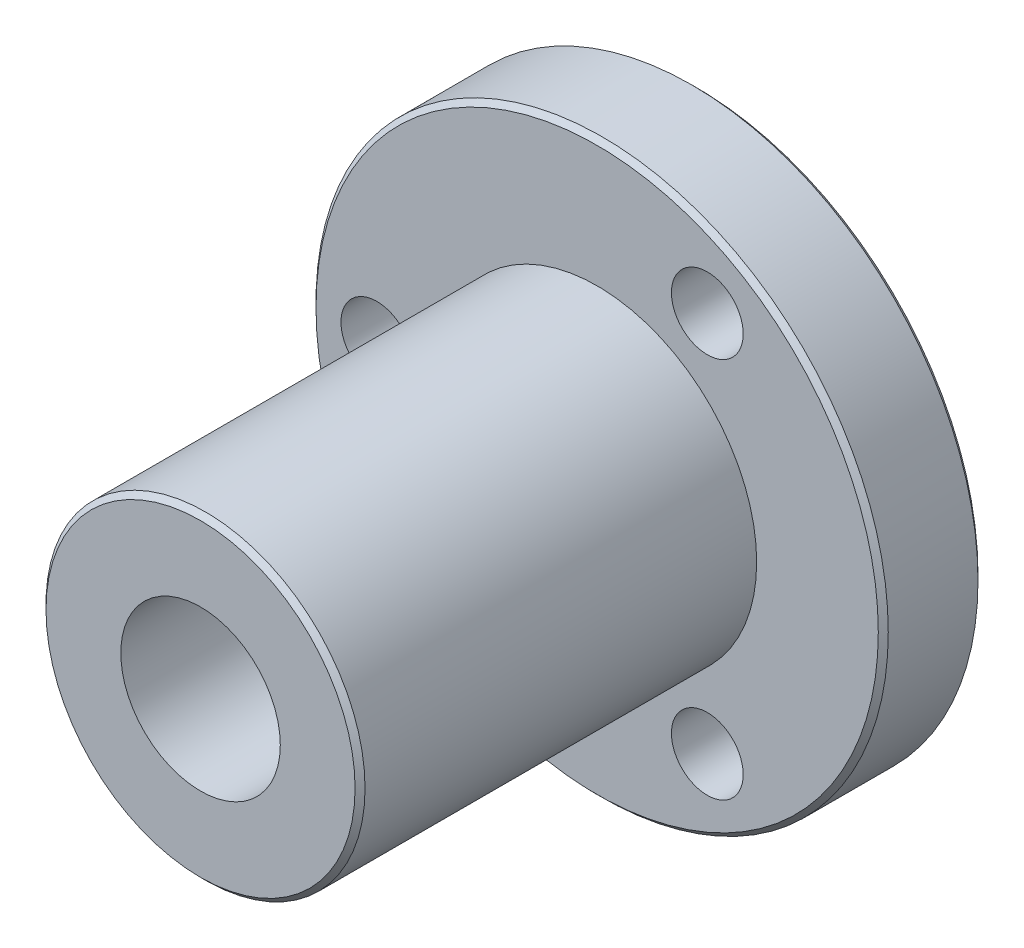
ISO-10303-21;
HEADER;
FILE_DESCRIPTION(('STEP AP214'),'2;1');
FILE_NAME('part.step','',(''),(''),'','','');
FILE_SCHEMA(('AUTOMOTIVE_DESIGN { 1 0 10303 214 1 1 1 1 }'));
ENDSEC;
DATA;
#1=APPLICATION_CONTEXT('core data for automotive mechanical design processes');
#2=APPLICATION_PROTOCOL_DEFINITION('international standard','automotive_design',2000,#1);
#3=PRODUCT_CONTEXT('',#1,'mechanical');
#4=PRODUCT('Part','Part','',(#3));
#5=PRODUCT_RELATED_PRODUCT_CATEGORY('part','',(#4));
#6=PRODUCT_DEFINITION_FORMATION('','',#4);
#7=PRODUCT_DEFINITION_CONTEXT('part definition',#1,'design');
#8=PRODUCT_DEFINITION('design','',#6,#7);
#9=PRODUCT_DEFINITION_SHAPE('','',#8);
#10=(LENGTH_UNIT() NAMED_UNIT(*) SI_UNIT(.MILLI.,.METRE.));
#11=(NAMED_UNIT(*) PLANE_ANGLE_UNIT() SI_UNIT($,.RADIAN.));
#12=(NAMED_UNIT(*) SI_UNIT($,.STERADIAN.) SOLID_ANGLE_UNIT());
#13=UNCERTAINTY_MEASURE_WITH_UNIT(LENGTH_MEASURE(1.E-05),#10,'distance_accuracy_value','');
#14=(GEOMETRIC_REPRESENTATION_CONTEXT(3) GLOBAL_UNCERTAINTY_ASSIGNED_CONTEXT((#13)) GLOBAL_UNIT_ASSIGNED_CONTEXT((#10,
#11,#12)) REPRESENTATION_CONTEXT('',''));
#15=CARTESIAN_POINT('',(0.,0.,0.));
#16=DIRECTION('',(0.,0.,1.));
#17=DIRECTION('',(1.,0.,0.));
#18=AXIS2_PLACEMENT_3D('',#15,#16,#17);
#19=CARTESIAN_POINT('',(0.,0.,5.));
#20=DIRECTION('',(0.,0.,1.));
#21=DIRECTION('',(1.,0.,0.));
#22=AXIS2_PLACEMENT_3D('',#19,#20,#21);
#23=PLANE('',#22);
#24=CARTESIAN_POINT('',(0.,0.,5.));
#25=DIRECTION('',(0.,0.,1.));
#26=DIRECTION('',(1.,0.,0.));
#27=AXIS2_PLACEMENT_3D('',#24,#25,#26);
#28=CIRCLE('',#27,14.1010000000001);
#29=CARTESIAN_POINT('',(14.1010000000001,0.,5.));
#30=VERTEX_POINT('',#29);
#31=EDGE_CURVE('E10',#30,#30,#28,.T.);
#32=ORIENTED_EDGE('',*,*,#31,.T.);
#33=EDGE_LOOP('',(#32));
#34=FACE_BOUND('',#33,.T.);
#35=CARTESIAN_POINT('',(5.5245,-9.56871468641426,5.));
#36=DIRECTION('',(0.,0.,1.));
#37=DIRECTION('',(1.,0.,0.));
#38=AXIS2_PLACEMENT_3D('',#35,#36,#37);
#39=CIRCLE('',#38,1.79999999999999);
#40=CARTESIAN_POINT('',(7.32449999999999,-9.56871468641426,5.));
#41=VERTEX_POINT('',#40);
#42=EDGE_CURVE('E74',#41,#41,#39,.T.);
#43=ORIENTED_EDGE('',*,*,#42,.F.);
#44=EDGE_LOOP('',(#43));
#45=FACE_BOUND('',#44,.T.);
#46=CARTESIAN_POINT('',(-11.049,0.,5.));
#47=DIRECTION('',(0.,0.,1.));
#48=DIRECTION('',(1.,0.,0.));
#49=AXIS2_PLACEMENT_3D('',#46,#47,#48);
#50=CIRCLE('',#49,1.79999999999999);
#51=CARTESIAN_POINT('',(-9.24900000000001,0.,5.));
#52=VERTEX_POINT('',#51);
#53=EDGE_CURVE('E68',#52,#52,#50,.T.);
#54=ORIENTED_EDGE('',*,*,#53,.F.);
#55=EDGE_LOOP('',(#54));
#56=FACE_BOUND('',#55,.T.);
#57=CARTESIAN_POINT('',(5.5245,9.56871468641426,5.));
#58=DIRECTION('',(0.,0.,1.));
#59=DIRECTION('',(1.,0.,0.));
#60=AXIS2_PLACEMENT_3D('',#57,#58,#59);
#61=CIRCLE('',#60,1.79999999999999);
#62=CARTESIAN_POINT('',(7.32449999999999,9.56871468641426,5.));
#63=VERTEX_POINT('',#62);
#64=EDGE_CURVE('E62',#63,#63,#61,.T.);
#65=ORIENTED_EDGE('',*,*,#64,.F.);
#66=EDGE_LOOP('',(#65));
#67=FACE_BOUND('',#66,.T.);
#68=CARTESIAN_POINT('',(0.,0.,5.));
#69=DIRECTION('',(0.,0.,1.));
#70=DIRECTION('',(1.,0.,0.));
#71=AXIS2_PLACEMENT_3D('',#68,#69,#70);
#72=CIRCLE('',#71,8.001);
#73=CARTESIAN_POINT('',(8.001,0.,5.));
#74=VERTEX_POINT('',#73);
#75=EDGE_CURVE('E56',#74,#74,#72,.T.);
#76=ORIENTED_EDGE('',*,*,#75,.F.);
#77=EDGE_LOOP('',(#76));
#78=FACE_BOUND('',#77,.T.);
#79=ADVANCED_FACE('F30',(#34,#45,#56,#67,#78),#23,.T.);
#80=CARTESIAN_POINT('',(0.,0.,0.));
#81=DIRECTION('',(0.,0.,1.));
#82=DIRECTION('',(1.,0.,0.));
#83=AXIS2_PLACEMENT_3D('',#80,#81,#82);
#84=CYLINDRICAL_SURFACE('',#83,14.351);
#85=CARTESIAN_POINT('',(0.,0.,0.2499999999999));
#86=DIRECTION('',(0.,0.,-1.));
#87=DIRECTION('',(-1.,0.,0.));
#88=AXIS2_PLACEMENT_3D('',#85,#86,#87);
#89=CIRCLE('',#88,14.351);
#90=CARTESIAN_POINT('',(-14.351,0.,0.2499999999999));
#91=VERTEX_POINT('',#90);
#92=EDGE_CURVE('E50',#91,#91,#89,.F.);
#93=ORIENTED_EDGE('',*,*,#92,.T.);
#94=EDGE_LOOP('',(#93));
#95=FACE_BOUND('',#94,.T.);
#96=CARTESIAN_POINT('',(0.,0.,4.75000000000009));
#97=DIRECTION('',(0.,0.,1.));
#98=DIRECTION('',(1.,0.,0.));
#99=AXIS2_PLACEMENT_3D('',#96,#97,#98);
#100=CIRCLE('',#99,14.351);
#101=CARTESIAN_POINT('',(14.351,0.,4.75000000000009));
#102=VERTEX_POINT('',#101);
#103=EDGE_CURVE('E53',#102,#102,#100,.F.);
#104=ORIENTED_EDGE('',*,*,#103,.T.);
#105=EDGE_LOOP('',(#104));
#106=FACE_BOUND('',#105,.T.);
#107=ADVANCED_FACE('F102',(#95,#106),#84,.T.);
#108=CARTESIAN_POINT('',(14.351,0.,0.));
#109=DIRECTION('',(0.,0.,-1.));
#110=DIRECTION('',(-1.,0.,0.));
#111=AXIS2_PLACEMENT_3D('',#108,#109,#110);
#112=PLANE('',#111);
#113=CARTESIAN_POINT('',(0.,0.,0.));
#114=DIRECTION('',(0.,0.,-1.));
#115=DIRECTION('',(-1.,0.,0.));
#116=AXIS2_PLACEMENT_3D('',#113,#114,#115);
#117=CIRCLE('',#116,14.1010000000001);
#118=CARTESIAN_POINT('',(-14.1010000000001,0.,0.));
#119=VERTEX_POINT('',#118);
#120=EDGE_CURVE('E45',#119,#119,#117,.T.);
#121=ORIENTED_EDGE('',*,*,#120,.T.);
#122=EDGE_LOOP('',(#121));
#123=FACE_BOUND('',#122,.T.);
#124=CARTESIAN_POINT('',(0.,0.,0.));
#125=DIRECTION('',(0.,0.,1.));
#126=DIRECTION('',(1.,0.,0.));
#127=AXIS2_PLACEMENT_3D('',#124,#125,#126);
#128=CIRCLE('',#127,3.99999999999999);
#129=CARTESIAN_POINT('',(3.99999999999999,0.,0.));
#130=VERTEX_POINT('',#129);
#131=EDGE_CURVE('E77',#130,#130,#128,.T.);
#132=ORIENTED_EDGE('',*,*,#131,.T.);
#133=EDGE_LOOP('',(#132));
#134=FACE_BOUND('',#133,.T.);
#135=CARTESIAN_POINT('',(5.5245,-9.56871468641426,0.));
#136=DIRECTION('',(0.,0.,1.));
#137=DIRECTION('',(1.,0.,0.));
#138=AXIS2_PLACEMENT_3D('',#135,#136,#137);
#139=CIRCLE('',#138,1.79999999999999);
#140=CARTESIAN_POINT('',(7.32449999999999,-9.56871468641426,0.));
#141=VERTEX_POINT('',#140);
#142=EDGE_CURVE('E71',#141,#141,#139,.T.);
#143=ORIENTED_EDGE('',*,*,#142,.T.);
#144=EDGE_LOOP('',(#143));
#145=FACE_BOUND('',#144,.T.);
#146=CARTESIAN_POINT('',(-11.049,0.,0.));
#147=DIRECTION('',(0.,0.,1.));
#148=DIRECTION('',(1.,0.,0.));
#149=AXIS2_PLACEMENT_3D('',#146,#147,#148);
#150=CIRCLE('',#149,1.79999999999999);
#151=CARTESIAN_POINT('',(-9.24900000000001,0.,0.));
#152=VERTEX_POINT('',#151);
#153=EDGE_CURVE('E65',#152,#152,#150,.T.);
#154=ORIENTED_EDGE('',*,*,#153,.T.);
#155=EDGE_LOOP('',(#154));
#156=FACE_BOUND('',#155,.T.);
#157=CARTESIAN_POINT('',(5.5245,9.56871468641426,0.));
#158=DIRECTION('',(0.,0.,1.));
#159=DIRECTION('',(1.,0.,0.));
#160=AXIS2_PLACEMENT_3D('',#157,#158,#159);
#161=CIRCLE('',#160,1.79999999999999);
#162=CARTESIAN_POINT('',(7.32449999999999,9.56871468641426,0.));
#163=VERTEX_POINT('',#162);
#164=EDGE_CURVE('E59',#163,#163,#161,.T.);
#165=ORIENTED_EDGE('',*,*,#164,.T.);
#166=EDGE_LOOP('',(#165));
#167=FACE_BOUND('',#166,.T.);
#168=ADVANCED_FACE('F99',(#123,#134,#145,#156,#167),#112,.T.);
#169=CARTESIAN_POINT('',(0.,0.,24.892));
#170=DIRECTION('',(0.,0.,-1.));
#171=DIRECTION('',(-1.,0.,0.));
#172=AXIS2_PLACEMENT_3D('',#169,#170,#171);
#173=CYLINDRICAL_SURFACE('',#172,8.001);
#174=CARTESIAN_POINT('',(0.,0.,24.6420000000001));
#175=DIRECTION('',(0.,0.,1.));
#176=DIRECTION('',(1.,0.,0.));
#177=AXIS2_PLACEMENT_3D('',#174,#175,#176);
#178=CIRCLE('',#177,8.001);
#179=CARTESIAN_POINT('',(8.001,0.,24.6420000000001));
#180=VERTEX_POINT('',#179);
#181=EDGE_CURVE('E37',#180,#180,#178,.F.);
#182=ORIENTED_EDGE('',*,*,#181,.T.);
#183=EDGE_LOOP('',(#182));
#184=FACE_BOUND('',#183,.T.);
#185=ORIENTED_EDGE('',*,*,#75,.T.);
#186=EDGE_LOOP('',(#185));
#187=FACE_BOUND('',#186,.T.);
#188=ADVANCED_FACE('F89',(#184,#187),#173,.T.);
#189=CARTESIAN_POINT('',(0.,0.,24.892));
#190=DIRECTION('',(0.,0.,1.));
#191=DIRECTION('',(1.,0.,0.));
#192=AXIS2_PLACEMENT_3D('',#189,#190,#191);
#193=PLANE('',#192);
#194=CARTESIAN_POINT('',(0.,0.,24.892));
#195=DIRECTION('',(0.,0.,1.));
#196=DIRECTION('',(1.,0.,0.));
#197=AXIS2_PLACEMENT_3D('',#194,#195,#196);
#198=CIRCLE('',#197,7.7510000000001);
#199=CARTESIAN_POINT('',(7.7510000000001,0.,24.892));
#200=VERTEX_POINT('',#199);
#201=EDGE_CURVE('E41',#200,#200,#198,.T.);
#202=ORIENTED_EDGE('',*,*,#201,.T.);
#203=EDGE_LOOP('',(#202));
#204=FACE_BOUND('',#203,.T.);
#205=CARTESIAN_POINT('',(0.,0.,24.892));
#206=DIRECTION('',(0.,0.,1.));
#207=DIRECTION('',(1.,0.,0.));
#208=AXIS2_PLACEMENT_3D('',#205,#206,#207);
#209=CIRCLE('',#208,3.99999999999999);
#210=CARTESIAN_POINT('',(3.99999999999999,0.,24.892));
#211=VERTEX_POINT('',#210);
#212=EDGE_CURVE('E80',#211,#211,#209,.T.);
#213=ORIENTED_EDGE('',*,*,#212,.F.);
#214=EDGE_LOOP('',(#213));
#215=FACE_BOUND('',#214,.T.);
#216=ADVANCED_FACE('F86',(#204,#215),#193,.T.);
#217=CARTESIAN_POINT('',(5.5245,9.56871468641426,5.));
#218=DIRECTION('',(0.,0.,1.));
#219=DIRECTION('',(1.,0.,0.));
#220=AXIS2_PLACEMENT_3D('',#217,#218,#219);
#221=CYLINDRICAL_SURFACE('',#220,1.79999999999999);
#222=ORIENTED_EDGE('',*,*,#164,.F.);
#223=EDGE_LOOP('',(#222));
#224=FACE_BOUND('',#223,.T.);
#225=ORIENTED_EDGE('',*,*,#64,.T.);
#226=EDGE_LOOP('',(#225));
#227=FACE_BOUND('',#226,.T.);
#228=ADVANCED_FACE('F88',(#224,#227),#221,.F.);
#229=CARTESIAN_POINT('',(-11.049,0.,5.));
#230=DIRECTION('',(0.,0.,1.));
#231=DIRECTION('',(1.,0.,0.));
#232=AXIS2_PLACEMENT_3D('',#229,#230,#231);
#233=CYLINDRICAL_SURFACE('',#232,1.79999999999999);
#234=ORIENTED_EDGE('',*,*,#153,.F.);
#235=EDGE_LOOP('',(#234));
#236=FACE_BOUND('',#235,.T.);
#237=ORIENTED_EDGE('',*,*,#53,.T.);
#238=EDGE_LOOP('',(#237));
#239=FACE_BOUND('',#238,.T.);
#240=ADVANCED_FACE('F96',(#236,#239),#233,.F.);
#241=CARTESIAN_POINT('',(5.5245,-9.56871468641426,5.));
#242=DIRECTION('',(0.,0.,1.));
#243=DIRECTION('',(1.,0.,0.));
#244=AXIS2_PLACEMENT_3D('',#241,#242,#243);
#245=CYLINDRICAL_SURFACE('',#244,1.79999999999999);
#246=ORIENTED_EDGE('',*,*,#142,.F.);
#247=EDGE_LOOP('',(#246));
#248=FACE_BOUND('',#247,.T.);
#249=ORIENTED_EDGE('',*,*,#42,.T.);
#250=EDGE_LOOP('',(#249));
#251=FACE_BOUND('',#250,.T.);
#252=ADVANCED_FACE('F177',(#248,#251),#245,.F.);
#253=CARTESIAN_POINT('',(0.,0.,24.892));
#254=DIRECTION('',(0.,0.,1.));
#255=DIRECTION('',(1.,0.,0.));
#256=AXIS2_PLACEMENT_3D('',#253,#254,#255);
#257=CYLINDRICAL_SURFACE('',#256,3.99999999999999);
#258=ORIENTED_EDGE('',*,*,#131,.F.);
#259=EDGE_LOOP('',(#258));
#260=FACE_BOUND('',#259,.T.);
#261=ORIENTED_EDGE('',*,*,#212,.T.);
#262=EDGE_LOOP('',(#261));
#263=FACE_BOUND('',#262,.T.);
#264=ADVANCED_FACE('F84',(#260,#263),#257,.F.);
#265=CARTESIAN_POINT('',(0.,0.,0.2499999999999));
#266=DIRECTION('',(0.,0.,1.));
#267=DIRECTION('',(1.,0.,0.));
#268=AXIS2_PLACEMENT_3D('',#265,#266,#267);
#269=CONICAL_SURFACE('',#268,14.351,0.785398163397445);
#270=ORIENTED_EDGE('',*,*,#120,.F.);
#271=EDGE_LOOP('',(#270));
#272=FACE_BOUND('',#271,.T.);
#273=ORIENTED_EDGE('',*,*,#92,.F.);
#274=EDGE_LOOP('',(#273));
#275=FACE_BOUND('',#274,.T.);
#276=ADVANCED_FACE('F114',(#272,#275),#269,.T.);
#277=CARTESIAN_POINT('',(0.,0.,24.892));
#278=DIRECTION('',(0.,0.,-1.));
#279=DIRECTION('',(-1.,0.,0.));
#280=AXIS2_PLACEMENT_3D('',#277,#278,#279);
#281=CONICAL_SURFACE('',#280,7.7510000000001,0.785398163397434);
#282=ORIENTED_EDGE('',*,*,#181,.F.);
#283=EDGE_LOOP('',(#282));
#284=FACE_BOUND('',#283,.T.);
#285=ORIENTED_EDGE('',*,*,#201,.F.);
#286=EDGE_LOOP('',(#285));
#287=FACE_BOUND('',#286,.T.);
#288=ADVANCED_FACE('F116',(#284,#287),#281,.T.);
#289=CARTESIAN_POINT('',(0.,0.,5.));
#290=DIRECTION('',(0.,0.,-1.));
#291=DIRECTION('',(-1.,0.,0.));
#292=AXIS2_PLACEMENT_3D('',#289,#290,#291);
#293=CONICAL_SURFACE('',#292,14.1010000000001,0.785398163397441);
#294=ORIENTED_EDGE('',*,*,#103,.F.);
#295=EDGE_LOOP('',(#294));
#296=FACE_BOUND('',#295,.T.);
#297=ORIENTED_EDGE('',*,*,#31,.F.);
#298=EDGE_LOOP('',(#297));
#299=FACE_BOUND('',#298,.T.);
#300=ADVANCED_FACE('F32',(#296,#299),#293,.T.);
#301=CLOSED_SHELL('',(#79,#107,#168,#188,#216,#228,#240,#252,#264,#276,#288,#300));
#302=MANIFOLD_SOLID_BREP('B2',#301);
#303=ADVANCED_BREP_SHAPE_REPRESENTATION('',(#18,#302),#14);
#304=SHAPE_DEFINITION_REPRESENTATION(#9,#303);
ENDSEC;
END-ISO-10303-21;
